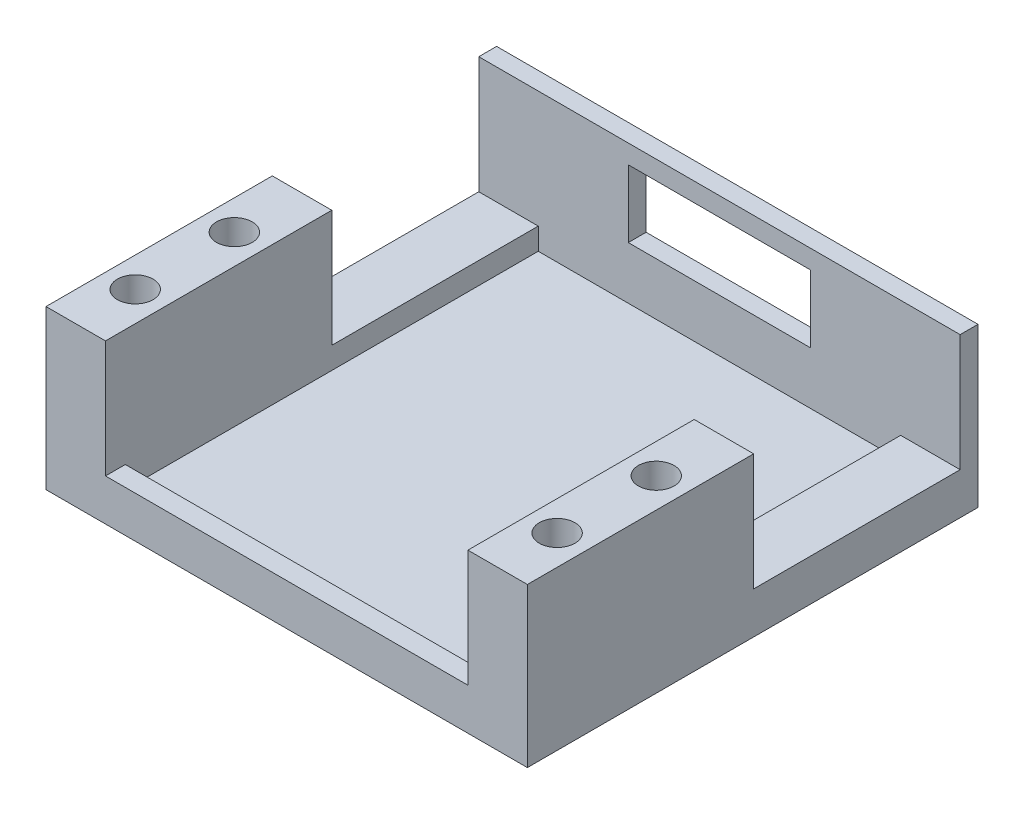
ISO-10303-21;
HEADER;
FILE_DESCRIPTION(('STEP AP214'),'2;1');
FILE_NAME('part.step','',(''),(''),'','','');
FILE_SCHEMA(('AUTOMOTIVE_DESIGN { 1 0 10303 214 1 1 1 1 }'));
ENDSEC;
DATA;
#1=APPLICATION_CONTEXT('core data for automotive mechanical design processes');
#2=APPLICATION_PROTOCOL_DEFINITION('international standard','automotive_design',2000,#1);
#3=PRODUCT_CONTEXT('',#1,'mechanical');
#4=PRODUCT('Part','Part','',(#3));
#5=PRODUCT_RELATED_PRODUCT_CATEGORY('part','',(#4));
#6=PRODUCT_DEFINITION_FORMATION('','',#4);
#7=PRODUCT_DEFINITION_CONTEXT('part definition',#1,'design');
#8=PRODUCT_DEFINITION('design','',#6,#7);
#9=PRODUCT_DEFINITION_SHAPE('','',#8);
#10=(LENGTH_UNIT() NAMED_UNIT(*) SI_UNIT(.MILLI.,.METRE.));
#11=(NAMED_UNIT(*) PLANE_ANGLE_UNIT() SI_UNIT($,.RADIAN.));
#12=(NAMED_UNIT(*) SI_UNIT($,.STERADIAN.) SOLID_ANGLE_UNIT());
#13=UNCERTAINTY_MEASURE_WITH_UNIT(LENGTH_MEASURE(1.E-05),#10,'distance_accuracy_value','');
#14=(GEOMETRIC_REPRESENTATION_CONTEXT(3) GLOBAL_UNCERTAINTY_ASSIGNED_CONTEXT((#13)) GLOBAL_UNIT_ASSIGNED_CONTEXT((#10,
#11,#12)) REPRESENTATION_CONTEXT('',''));
#15=CARTESIAN_POINT('',(0.,0.,0.));
#16=DIRECTION('',(0.,0.,1.));
#17=DIRECTION('',(1.,0.,0.));
#18=AXIS2_PLACEMENT_3D('',#15,#16,#17);
#19=CARTESIAN_POINT('',(0.,0.,0.));
#20=DIRECTION('',(0.,1.,0.));
#21=DIRECTION('',(0.,0.,1.));
#22=AXIS2_PLACEMENT_3D('',#19,#20,#21);
#23=PLANE('',#22);
#24=DIRECTION('',(1.,0.,0.));
#25=VECTOR('',#24,1.);
#26=CARTESIAN_POINT('',(0.,0.,1.));
#27=LINE('',#26,#25);
#28=CARTESIAN_POINT('',(0.,0.,1.));
#29=VERTEX_POINT('',#28);
#30=CARTESIAN_POINT('',(18.28,0.,1.));
#31=VERTEX_POINT('',#30);
#32=EDGE_CURVE('E292',#29,#31,#27,.T.);
#33=ORIENTED_EDGE('',*,*,#32,.T.);
#34=DIRECTION('',(0.,0.,1.));
#35=VECTOR('',#34,1.);
#36=CARTESIAN_POINT('',(18.28,0.,-10.414));
#37=LINE('',#36,#35);
#38=CARTESIAN_POINT('',(18.28,0.,0.));
#39=VERTEX_POINT('',#38);
#40=EDGE_CURVE('E192',#39,#31,#37,.T.);
#41=ORIENTED_EDGE('',*,*,#40,.F.);
#42=DIRECTION('',(1.,0.,0.));
#43=VECTOR('',#42,1.);
#44=CARTESIAN_POINT('',(0.,0.,0.));
#45=LINE('',#44,#43);
#46=CARTESIAN_POINT('',(0.,0.,0.));
#47=VERTEX_POINT('',#46);
#48=EDGE_CURVE('E282',#47,#39,#45,.T.);
#49=ORIENTED_EDGE('',*,*,#48,.F.);
#50=DIRECTION('',(0.,0.,-1.));
#51=VECTOR('',#50,1.);
#52=CARTESIAN_POINT('',(0.,0.,-10.414));
#53=LINE('',#52,#51);
#54=EDGE_CURVE('E217',#29,#47,#53,.T.);
#55=ORIENTED_EDGE('',*,*,#54,.F.);
#56=EDGE_LOOP('',(#33,#41,#49,#55));
#57=FACE_BOUND('',#56,.T.);
#58=ADVANCED_FACE('F39',(#57),#23,.T.);
#59=DIRECTION('',(0.,0.,-1.));
#60=VECTOR('',#59,1.);
#61=CARTESIAN_POINT('',(18.28,0.,0.));
#62=LINE('',#61,#60);
#63=CARTESIAN_POINT('',(18.28,0.,-10.414));
#64=VERTEX_POINT('',#63);
#65=CARTESIAN_POINT('',(18.28,0.,-20.828));
#66=VERTEX_POINT('',#65);
#67=EDGE_CURVE('E59',#64,#66,#62,.T.);
#68=ORIENTED_EDGE('',*,*,#67,.F.);
#69=DIRECTION('',(-1.,0.,0.));
#70=VECTOR('',#69,1.);
#71=CARTESIAN_POINT('',(21.28,0.,-10.414));
#72=LINE('',#71,#70);
#73=CARTESIAN_POINT('',(21.28,0.,-10.414));
#74=VERTEX_POINT('',#73);
#75=EDGE_CURVE('E54',#74,#64,#72,.T.);
#76=ORIENTED_EDGE('',*,*,#75,.F.);
#77=DIRECTION('',(0.,0.,1.));
#78=VECTOR('',#77,1.);
#79=CARTESIAN_POINT('',(21.28,0.,0.));
#80=LINE('',#79,#78);
#81=CARTESIAN_POINT('',(21.28,0.,-20.828));
#82=VERTEX_POINT('',#81);
#83=EDGE_CURVE('E297',#82,#74,#80,.T.);
#84=ORIENTED_EDGE('',*,*,#83,.F.);
#85=DIRECTION('',(1.,0.,0.));
#86=VECTOR('',#85,1.);
#87=CARTESIAN_POINT('',(0.,0.,-20.828));
#88=LINE('',#87,#86);
#89=EDGE_CURVE('E315',#66,#82,#88,.T.);
#90=ORIENTED_EDGE('',*,*,#89,.F.);
#91=EDGE_LOOP('',(#68,#76,#84,#90));
#92=FACE_BOUND('',#91,.T.);
#93=ADVANCED_FACE('F356',(#92),#23,.T.);
#94=DIRECTION('',(0.,0.,1.));
#95=VECTOR('',#94,1.);
#96=CARTESIAN_POINT('',(-3.,0.,0.));
#97=LINE('',#96,#95);
#98=CARTESIAN_POINT('',(-3.,0.,-20.828));
#99=VERTEX_POINT('',#98);
#100=CARTESIAN_POINT('',(-3.,0.,-10.414));
#101=VERTEX_POINT('',#100);
#102=EDGE_CURVE('E294',#99,#101,#97,.T.);
#103=ORIENTED_EDGE('',*,*,#102,.T.);
#104=DIRECTION('',(-1.,0.,0.));
#105=VECTOR('',#104,1.);
#106=CARTESIAN_POINT('',(-3.,0.,-10.414));
#107=LINE('',#106,#105);
#108=CARTESIAN_POINT('',(0.,0.,-10.414));
#109=VERTEX_POINT('',#108);
#110=EDGE_CURVE('E220',#109,#101,#107,.T.);
#111=ORIENTED_EDGE('',*,*,#110,.F.);
#112=DIRECTION('',(0.,0.,-1.));
#113=VECTOR('',#112,1.);
#114=CARTESIAN_POINT('',(0.,0.,0.));
#115=LINE('',#114,#113);
#116=CARTESIAN_POINT('',(0.,0.,-20.828));
#117=VERTEX_POINT('',#116);
#118=EDGE_CURVE('E289',#109,#117,#115,.T.);
#119=ORIENTED_EDGE('',*,*,#118,.T.);
#120=EDGE_CURVE('E322',#99,#117,#88,.T.);
#121=ORIENTED_EDGE('',*,*,#120,.F.);
#122=EDGE_LOOP('',(#103,#111,#119,#121));
#123=FACE_BOUND('',#122,.T.);
#124=ADVANCED_FACE('F358',(#123),#23,.T.);
#125=CARTESIAN_POINT('',(0.,1.55,0.));
#126=DIRECTION('',(0.,1.,0.));
#127=DIRECTION('',(0.,0.,1.));
#128=AXIS2_PLACEMENT_3D('',#125,#126,#127);
#129=PLANE('',#128);
#130=DIRECTION('',(1.,0.,0.));
#131=VECTOR('',#130,1.);
#132=CARTESIAN_POINT('',(0.,1.55,-20.828));
#133=LINE('',#132,#131);
#134=CARTESIAN_POINT('',(4.54,1.55,-20.828));
#135=VERTEX_POINT('',#134);
#136=CARTESIAN_POINT('',(13.74,1.55,-20.828));
#137=VERTEX_POINT('',#136);
#138=EDGE_CURVE('E318',#135,#137,#133,.T.);
#139=ORIENTED_EDGE('',*,*,#138,.T.);
#140=DIRECTION('',(0.,0.,1.));
#141=VECTOR('',#140,1.);
#142=CARTESIAN_POINT('',(13.74,1.55,0.));
#143=LINE('',#142,#141);
#144=CARTESIAN_POINT('',(13.74,1.55,-21.728));
#145=VERTEX_POINT('',#144);
#146=EDGE_CURVE('E247',#145,#137,#143,.T.);
#147=ORIENTED_EDGE('',*,*,#146,.F.);
#148=DIRECTION('',(1.,0.,0.));
#149=VECTOR('',#148,1.);
#150=CARTESIAN_POINT('',(0.,1.55,-21.728));
#151=LINE('',#150,#149);
#152=CARTESIAN_POINT('',(4.54,1.55,-21.728));
#153=VERTEX_POINT('',#152);
#154=EDGE_CURVE('E321',#153,#145,#151,.T.);
#155=ORIENTED_EDGE('',*,*,#154,.F.);
#156=DIRECTION('',(0.,0.,1.));
#157=VECTOR('',#156,1.);
#158=CARTESIAN_POINT('',(4.54,1.55,0.));
#159=LINE('',#158,#157);
#160=EDGE_CURVE('E261',#153,#135,#159,.T.);
#161=ORIENTED_EDGE('',*,*,#160,.T.);
#162=EDGE_LOOP('',(#139,#147,#155,#161));
#163=FACE_BOUND('',#162,.T.);
#164=ADVANCED_FACE('F364',(#163),#129,.T.);
#165=CARTESIAN_POINT('',(0.,1.55,-20.828));
#166=DIRECTION('',(0.,0.,-1.));
#167=DIRECTION('',(-1.,0.,0.));
#168=AXIS2_PLACEMENT_3D('',#165,#166,#167);
#169=PLANE('',#168);
#170=DIRECTION('',(0.,-1.,0.));
#171=VECTOR('',#170,1.);
#172=CARTESIAN_POINT('',(4.54,4.95,-20.828));
#173=LINE('',#172,#171);
#174=CARTESIAN_POINT('',(4.54,4.95,-20.828));
#175=VERTEX_POINT('',#174);
#176=EDGE_CURVE('E265',#175,#135,#173,.T.);
#177=ORIENTED_EDGE('',*,*,#176,.F.);
#178=DIRECTION('',(1.,0.,0.));
#179=VECTOR('',#178,1.);
#180=CARTESIAN_POINT('',(-3.,4.95,-20.828));
#181=LINE('',#180,#179);
#182=CARTESIAN_POINT('',(13.74,4.95,-20.828));
#183=VERTEX_POINT('',#182);
#184=EDGE_CURVE('E216',#175,#183,#181,.T.);
#185=ORIENTED_EDGE('',*,*,#184,.T.);
#186=DIRECTION('',(0.,-1.,0.));
#187=VECTOR('',#186,1.);
#188=CARTESIAN_POINT('',(13.74,4.95,-20.828));
#189=LINE('',#188,#187);
#190=EDGE_CURVE('E255',#183,#137,#189,.T.);
#191=ORIENTED_EDGE('',*,*,#190,.T.);
#192=ORIENTED_EDGE('',*,*,#138,.F.);
#193=EDGE_LOOP('',(#177,#185,#191,#192));
#194=FACE_BOUND('',#193,.T.);
#195=DIRECTION('',(0.,1.,0.));
#196=VECTOR('',#195,1.);
#197=CARTESIAN_POINT('',(0.,-35.3577868175259,-20.828));
#198=LINE('',#197,#196);
#199=CARTESIAN_POINT('',(0.,-1.1,-20.828));
#200=VERTEX_POINT('',#199);
#201=EDGE_CURVE('E281',#200,#117,#198,.T.);
#202=ORIENTED_EDGE('',*,*,#201,.F.);
#203=DIRECTION('',(1.,0.,0.));
#204=VECTOR('',#203,1.);
#205=CARTESIAN_POINT('',(0.,-1.1,-20.828));
#206=LINE('',#205,#204);
#207=CARTESIAN_POINT('',(18.28,-1.1,-20.828));
#208=VERTEX_POINT('',#207);
#209=EDGE_CURVE('E275',#200,#208,#206,.T.);
#210=ORIENTED_EDGE('',*,*,#209,.T.);
#211=DIRECTION('',(0.,1.,0.));
#212=VECTOR('',#211,1.);
#213=CARTESIAN_POINT('',(18.28,-35.3577868175259,-20.828));
#214=LINE('',#213,#212);
#215=EDGE_CURVE('E296',#208,#66,#214,.T.);
#216=ORIENTED_EDGE('',*,*,#215,.T.);
#217=ORIENTED_EDGE('',*,*,#89,.T.);
#218=DIRECTION('',(0.,-1.,0.));
#219=VECTOR('',#218,1.);
#220=CARTESIAN_POINT('',(21.28,1.55,-20.828));
#221=LINE('',#220,#219);
#222=CARTESIAN_POINT('',(21.28,5.9,-20.828));
#223=VERTEX_POINT('',#222);
#224=EDGE_CURVE('E11',#223,#82,#221,.T.);
#225=ORIENTED_EDGE('',*,*,#224,.F.);
#226=DIRECTION('',(1.,0.,0.));
#227=VECTOR('',#226,1.);
#228=CARTESIAN_POINT('',(-3.,5.9,-20.828));
#229=LINE('',#228,#227);
#230=CARTESIAN_POINT('',(-3.,5.9,-20.828));
#231=VERTEX_POINT('',#230);
#232=EDGE_CURVE('E237',#231,#223,#229,.T.);
#233=ORIENTED_EDGE('',*,*,#232,.F.);
#234=DIRECTION('',(0.,-1.,0.));
#235=VECTOR('',#234,1.);
#236=CARTESIAN_POINT('',(-3.,1.55,-20.828));
#237=LINE('',#236,#235);
#238=EDGE_CURVE('E325',#231,#99,#237,.T.);
#239=ORIENTED_EDGE('',*,*,#238,.T.);
#240=ORIENTED_EDGE('',*,*,#120,.T.);
#241=EDGE_LOOP('',(#202,#210,#216,#217,#225,#233,#239,#240));
#242=FACE_BOUND('',#241,.T.);
#243=ADVANCED_FACE('F41',(#194,#242),#169,.F.);
#244=CARTESIAN_POINT('',(21.28,1.55,0.));
#245=DIRECTION('',(-1.,0.,0.));
#246=DIRECTION('',(0.,0.,1.));
#247=AXIS2_PLACEMENT_3D('',#244,#245,#246);
#248=PLANE('',#247);
#249=ORIENTED_EDGE('',*,*,#224,.T.);
#250=ORIENTED_EDGE('',*,*,#83,.T.);
#251=DIRECTION('',(0.,-1.,0.));
#252=VECTOR('',#251,1.);
#253=CARTESIAN_POINT('',(21.28,17.7016692039728,-10.414));
#254=LINE('',#253,#252);
#255=CARTESIAN_POINT('',(21.28,5.9,-10.414));
#256=VERTEX_POINT('',#255);
#257=EDGE_CURVE('E194',#256,#74,#254,.T.);
#258=ORIENTED_EDGE('',*,*,#257,.F.);
#259=DIRECTION('',(0.,0.,1.));
#260=VECTOR('',#259,1.);
#261=CARTESIAN_POINT('',(21.28,5.9,-10.414));
#262=LINE('',#261,#260);
#263=CARTESIAN_POINT('',(21.28,5.9,1.));
#264=VERTEX_POINT('',#263);
#265=EDGE_CURVE('E201',#256,#264,#262,.T.);
#266=ORIENTED_EDGE('',*,*,#265,.T.);
#267=DIRECTION('',(0.,1.,0.));
#268=VECTOR('',#267,1.);
#269=CARTESIAN_POINT('',(21.28,-35.3577868175259,1.));
#270=LINE('',#269,#268);
#271=CARTESIAN_POINT('',(21.28,-2.1,1.));
#272=VERTEX_POINT('',#271);
#273=EDGE_CURVE('E200',#272,#264,#270,.T.);
#274=ORIENTED_EDGE('',*,*,#273,.F.);
#275=DIRECTION('',(0.,0.,-1.));
#276=VECTOR('',#275,1.);
#277=CARTESIAN_POINT('',(21.28,-2.1,0.));
#278=LINE('',#277,#276);
#279=CARTESIAN_POINT('',(21.28,-2.1,-21.728));
#280=VERTEX_POINT('',#279);
#281=EDGE_CURVE('E288',#272,#280,#278,.T.);
#282=ORIENTED_EDGE('',*,*,#281,.T.);
#283=DIRECTION('',(0.,-1.,0.));
#284=VECTOR('',#283,1.);
#285=CARTESIAN_POINT('',(21.28,1.55,-21.728));
#286=LINE('',#285,#284);
#287=CARTESIAN_POINT('',(21.28,5.9,-21.728));
#288=VERTEX_POINT('',#287);
#289=EDGE_CURVE('E47',#288,#280,#286,.T.);
#290=ORIENTED_EDGE('',*,*,#289,.F.);
#291=DIRECTION('',(0.,0.,-1.));
#292=VECTOR('',#291,1.);
#293=CARTESIAN_POINT('',(21.28,5.9,-20.828));
#294=LINE('',#293,#292);
#295=EDGE_CURVE('E241',#223,#288,#294,.T.);
#296=ORIENTED_EDGE('',*,*,#295,.F.);
#297=EDGE_LOOP('',(#249,#250,#258,#266,#274,#282,#290,#296));
#298=FACE_BOUND('',#297,.T.);
#299=ADVANCED_FACE('F341',(#298),#248,.F.);
#300=CARTESIAN_POINT('',(0.,1.55,-21.728));
#301=DIRECTION('',(0.,0.,-1.));
#302=DIRECTION('',(-1.,0.,0.));
#303=AXIS2_PLACEMENT_3D('',#300,#301,#302);
#304=PLANE('',#303);
#305=DIRECTION('',(0.,-1.,0.));
#306=VECTOR('',#305,1.);
#307=CARTESIAN_POINT('',(-3.,1.55,-21.728));
#308=LINE('',#307,#306);
#309=CARTESIAN_POINT('',(-3.,5.9,-21.728));
#310=VERTEX_POINT('',#309);
#311=CARTESIAN_POINT('',(-3.,-2.1,-21.728));
#312=VERTEX_POINT('',#311);
#313=EDGE_CURVE('E330',#310,#312,#308,.T.);
#314=ORIENTED_EDGE('',*,*,#313,.F.);
#315=DIRECTION('',(-1.,0.,0.));
#316=VECTOR('',#315,1.);
#317=CARTESIAN_POINT('',(-3.,5.9,-21.728));
#318=LINE('',#317,#316);
#319=EDGE_CURVE('E244',#288,#310,#318,.T.);
#320=ORIENTED_EDGE('',*,*,#319,.F.);
#321=ORIENTED_EDGE('',*,*,#289,.T.);
#322=DIRECTION('',(-1.,0.,0.));
#323=VECTOR('',#322,1.);
#324=CARTESIAN_POINT('',(0.,-2.1,-21.728));
#325=LINE('',#324,#323);
#326=EDGE_CURVE('E303',#280,#312,#325,.T.);
#327=ORIENTED_EDGE('',*,*,#326,.T.);
#328=EDGE_LOOP('',(#314,#320,#321,#327));
#329=FACE_BOUND('',#328,.T.);
#330=DIRECTION('',(-1.,0.,0.));
#331=VECTOR('',#330,1.);
#332=CARTESIAN_POINT('',(-3.,4.95,-21.728));
#333=LINE('',#332,#331);
#334=CARTESIAN_POINT('',(13.74,4.95,-21.728));
#335=VERTEX_POINT('',#334);
#336=CARTESIAN_POINT('',(4.54,4.95,-21.728));
#337=VERTEX_POINT('',#336);
#338=EDGE_CURVE('E238',#335,#337,#333,.T.);
#339=ORIENTED_EDGE('',*,*,#338,.T.);
#340=DIRECTION('',(0.,-1.,0.));
#341=VECTOR('',#340,1.);
#342=CARTESIAN_POINT('',(4.54,4.95,-21.728));
#343=LINE('',#342,#341);
#344=EDGE_CURVE('E269',#337,#153,#343,.T.);
#345=ORIENTED_EDGE('',*,*,#344,.T.);
#346=ORIENTED_EDGE('',*,*,#154,.T.);
#347=DIRECTION('',(0.,-1.,0.));
#348=VECTOR('',#347,1.);
#349=CARTESIAN_POINT('',(13.74,4.95,-21.728));
#350=LINE('',#349,#348);
#351=EDGE_CURVE('E259',#335,#145,#350,.T.);
#352=ORIENTED_EDGE('',*,*,#351,.F.);
#353=EDGE_LOOP('',(#339,#345,#346,#352));
#354=FACE_BOUND('',#353,.T.);
#355=ADVANCED_FACE('F334',(#329,#354),#304,.T.);
#356=CARTESIAN_POINT('',(-3.,1.55,0.));
#357=DIRECTION('',(-1.,0.,0.));
#358=DIRECTION('',(0.,0.,1.));
#359=AXIS2_PLACEMENT_3D('',#356,#357,#358);
#360=PLANE('',#359);
#361=ORIENTED_EDGE('',*,*,#313,.T.);
#362=DIRECTION('',(0.,0.,-1.));
#363=VECTOR('',#362,1.);
#364=CARTESIAN_POINT('',(-3.,-2.1,0.));
#365=LINE('',#364,#363);
#366=CARTESIAN_POINT('',(-3.,-2.1,1.));
#367=VERTEX_POINT('',#366);
#368=EDGE_CURVE('E312',#367,#312,#365,.T.);
#369=ORIENTED_EDGE('',*,*,#368,.F.);
#370=DIRECTION('',(0.,1.,0.));
#371=VECTOR('',#370,1.);
#372=CARTESIAN_POINT('',(-3.,-35.3577868175259,1.));
#373=LINE('',#372,#371);
#374=CARTESIAN_POINT('',(-3.,5.9,1.));
#375=VERTEX_POINT('',#374);
#376=EDGE_CURVE('E307',#367,#375,#373,.T.);
#377=ORIENTED_EDGE('',*,*,#376,.T.);
#378=DIRECTION('',(0.,0.,-1.));
#379=VECTOR('',#378,1.);
#380=CARTESIAN_POINT('',(-3.,5.9,-10.414));
#381=LINE('',#380,#379);
#382=CARTESIAN_POINT('',(-3.,5.9,-10.414));
#383=VERTEX_POINT('',#382);
#384=EDGE_CURVE('E213',#375,#383,#381,.T.);
#385=ORIENTED_EDGE('',*,*,#384,.T.);
#386=DIRECTION('',(0.,-1.,0.));
#387=VECTOR('',#386,1.);
#388=CARTESIAN_POINT('',(-3.,17.7016692039728,-10.414));
#389=LINE('',#388,#387);
#390=EDGE_CURVE('E223',#383,#101,#389,.T.);
#391=ORIENTED_EDGE('',*,*,#390,.T.);
#392=ORIENTED_EDGE('',*,*,#102,.F.);
#393=ORIENTED_EDGE('',*,*,#238,.F.);
#394=DIRECTION('',(0.,0.,1.));
#395=VECTOR('',#394,1.);
#396=CARTESIAN_POINT('',(-3.,5.9,-20.828));
#397=LINE('',#396,#395);
#398=EDGE_CURVE('E234',#310,#231,#397,.T.);
#399=ORIENTED_EDGE('',*,*,#398,.F.);
#400=EDGE_LOOP('',(#361,#369,#377,#385,#391,#392,#393,#399));
#401=FACE_BOUND('',#400,.T.);
#402=ADVANCED_FACE('F347',(#401),#360,.T.);
#403=CARTESIAN_POINT('',(0.,-35.3577868175259,0.));
#404=DIRECTION('',(1.,0.,0.));
#405=DIRECTION('',(0.,0.,-1.));
#406=AXIS2_PLACEMENT_3D('',#403,#404,#405);
#407=PLANE('',#406);
#408=DIRECTION('',(0.,0.,-1.));
#409=VECTOR('',#408,1.);
#410=CARTESIAN_POINT('',(0.,-1.1,0.));
#411=LINE('',#410,#409);
#412=CARTESIAN_POINT('',(0.,-1.1,0.));
#413=VERTEX_POINT('',#412);
#414=EDGE_CURVE('E278',#413,#200,#411,.T.);
#415=ORIENTED_EDGE('',*,*,#414,.T.);
#416=ORIENTED_EDGE('',*,*,#201,.T.);
#417=ORIENTED_EDGE('',*,*,#118,.F.);
#418=DIRECTION('',(0.,-1.,0.));
#419=VECTOR('',#418,1.);
#420=CARTESIAN_POINT('',(0.,17.7016692039728,-10.414));
#421=LINE('',#420,#419);
#422=CARTESIAN_POINT('',(0.,5.9,-10.414));
#423=VERTEX_POINT('',#422);
#424=EDGE_CURVE('E226',#423,#109,#421,.T.);
#425=ORIENTED_EDGE('',*,*,#424,.F.);
#426=DIRECTION('',(0.,0.,1.));
#427=VECTOR('',#426,1.);
#428=CARTESIAN_POINT('',(0.,5.9,-10.414));
#429=LINE('',#428,#427);
#430=CARTESIAN_POINT('',(0.,5.9,1.));
#431=VERTEX_POINT('',#430);
#432=EDGE_CURVE('E206',#423,#431,#429,.T.);
#433=ORIENTED_EDGE('',*,*,#432,.T.);
#434=DIRECTION('',(0.,-1.,0.));
#435=VECTOR('',#434,1.);
#436=CARTESIAN_POINT('',(0.,17.7016692039728,1.));
#437=LINE('',#436,#435);
#438=EDGE_CURVE('E229',#431,#29,#437,.T.);
#439=ORIENTED_EDGE('',*,*,#438,.T.);
#440=ORIENTED_EDGE('',*,*,#54,.T.);
#441=DIRECTION('',(0.,1.,0.));
#442=VECTOR('',#441,1.);
#443=CARTESIAN_POINT('',(0.,-35.3577868175259,0.));
#444=LINE('',#443,#442);
#445=EDGE_CURVE('E286',#413,#47,#444,.T.);
#446=ORIENTED_EDGE('',*,*,#445,.F.);
#447=EDGE_LOOP('',(#415,#416,#417,#425,#433,#439,#440,#446));
#448=FACE_BOUND('',#447,.T.);
#449=ADVANCED_FACE('F378',(#448),#407,.T.);
#450=CARTESIAN_POINT('',(0.,-35.3577868175259,0.));
#451=DIRECTION('',(0.,0.,1.));
#452=DIRECTION('',(1.,0.,0.));
#453=AXIS2_PLACEMENT_3D('',#450,#451,#452);
#454=PLANE('',#453);
#455=DIRECTION('',(0.,1.,0.));
#456=VECTOR('',#455,1.);
#457=CARTESIAN_POINT('',(18.28,-35.3577868175259,0.));
#458=LINE('',#457,#456);
#459=CARTESIAN_POINT('',(18.28,-1.1,0.));
#460=VERTEX_POINT('',#459);
#461=EDGE_CURVE('E285',#460,#39,#458,.T.);
#462=ORIENTED_EDGE('',*,*,#461,.F.);
#463=DIRECTION('',(1.,0.,0.));
#464=VECTOR('',#463,1.);
#465=CARTESIAN_POINT('',(0.,-1.1,0.));
#466=LINE('',#465,#464);
#467=EDGE_CURVE('E271',#413,#460,#466,.T.);
#468=ORIENTED_EDGE('',*,*,#467,.F.);
#469=ORIENTED_EDGE('',*,*,#445,.T.);
#470=ORIENTED_EDGE('',*,*,#48,.T.);
#471=EDGE_LOOP('',(#462,#468,#469,#470));
#472=FACE_BOUND('',#471,.T.);
#473=ADVANCED_FACE('F375',(#472),#454,.F.);
#474=CARTESIAN_POINT('',(18.28,-35.3577868175259,0.));
#475=DIRECTION('',(1.,0.,0.));
#476=DIRECTION('',(0.,0.,-1.));
#477=AXIS2_PLACEMENT_3D('',#474,#475,#476);
#478=PLANE('',#477);
#479=ORIENTED_EDGE('',*,*,#215,.F.);
#480=DIRECTION('',(0.,0.,-1.));
#481=VECTOR('',#480,1.);
#482=CARTESIAN_POINT('',(18.28,-1.1,0.));
#483=LINE('',#482,#481);
#484=EDGE_CURVE('E273',#460,#208,#483,.T.);
#485=ORIENTED_EDGE('',*,*,#484,.F.);
#486=ORIENTED_EDGE('',*,*,#461,.T.);
#487=ORIENTED_EDGE('',*,*,#40,.T.);
#488=DIRECTION('',(0.,-1.,0.));
#489=VECTOR('',#488,1.);
#490=CARTESIAN_POINT('',(18.28,17.7016692039728,1.));
#491=LINE('',#490,#489);
#492=CARTESIAN_POINT('',(18.28,5.9,1.));
#493=VERTEX_POINT('',#492);
#494=EDGE_CURVE('E188',#493,#31,#491,.T.);
#495=ORIENTED_EDGE('',*,*,#494,.F.);
#496=DIRECTION('',(0.,0.,-1.));
#497=VECTOR('',#496,1.);
#498=CARTESIAN_POINT('',(18.28,5.9,-10.414));
#499=LINE('',#498,#497);
#500=CARTESIAN_POINT('',(18.28,5.9,-10.414));
#501=VERTEX_POINT('',#500);
#502=EDGE_CURVE('E175',#493,#501,#499,.T.);
#503=ORIENTED_EDGE('',*,*,#502,.T.);
#504=DIRECTION('',(0.,-1.,0.));
#505=VECTOR('',#504,1.);
#506=CARTESIAN_POINT('',(18.28,17.7016692039728,-10.414));
#507=LINE('',#506,#505);
#508=EDGE_CURVE('E195',#501,#64,#507,.T.);
#509=ORIENTED_EDGE('',*,*,#508,.T.);
#510=ORIENTED_EDGE('',*,*,#67,.T.);
#511=EDGE_LOOP('',(#479,#485,#486,#487,#495,#503,#509,#510));
#512=FACE_BOUND('',#511,.T.);
#513=ADVANCED_FACE('F190',(#512),#478,.F.);
#514=CARTESIAN_POINT('',(0.,-35.3577868175259,1.));
#515=DIRECTION('',(0.,0.,1.));
#516=DIRECTION('',(1.,0.,0.));
#517=AXIS2_PLACEMENT_3D('',#514,#515,#516);
#518=PLANE('',#517);
#519=DIRECTION('',(-1.,0.,0.));
#520=VECTOR('',#519,1.);
#521=CARTESIAN_POINT('',(0.,-2.1,1.));
#522=LINE('',#521,#520);
#523=EDGE_CURVE('E291',#272,#367,#522,.T.);
#524=ORIENTED_EDGE('',*,*,#523,.F.);
#525=ORIENTED_EDGE('',*,*,#273,.T.);
#526=DIRECTION('',(-1.,0.,0.));
#527=VECTOR('',#526,1.);
#528=CARTESIAN_POINT('',(21.28,5.9,1.));
#529=LINE('',#528,#527);
#530=EDGE_CURVE('E179',#264,#493,#529,.T.);
#531=ORIENTED_EDGE('',*,*,#530,.T.);
#532=ORIENTED_EDGE('',*,*,#494,.T.);
#533=ORIENTED_EDGE('',*,*,#32,.F.);
#534=ORIENTED_EDGE('',*,*,#438,.F.);
#535=DIRECTION('',(-1.,0.,0.));
#536=VECTOR('',#535,1.);
#537=CARTESIAN_POINT('',(-3.,5.9,1.));
#538=LINE('',#537,#536);
#539=EDGE_CURVE('E209',#431,#375,#538,.T.);
#540=ORIENTED_EDGE('',*,*,#539,.T.);
#541=ORIENTED_EDGE('',*,*,#376,.F.);
#542=EDGE_LOOP('',(#524,#525,#531,#532,#533,#534,#540,#541));
#543=FACE_BOUND('',#542,.T.);
#544=ADVANCED_FACE('F198',(#543),#518,.T.);
#545=CARTESIAN_POINT('',(0.,-2.1,0.));
#546=DIRECTION('',(0.,1.,0.));
#547=DIRECTION('',(0.,0.,1.));
#548=AXIS2_PLACEMENT_3D('',#545,#546,#547);
#549=PLANE('',#548);
#550=CARTESIAN_POINT('',(19.78,-2.1,-2.));
#551=DIRECTION('',(0.,1.,0.));
#552=DIRECTION('',(0.,0.,1.));
#553=AXIS2_PLACEMENT_3D('',#550,#551,#552);
#554=CIRCLE('',#553,0.9);
#555=CARTESIAN_POINT('',(19.78,-2.1,-1.1));
#556=VERTEX_POINT('',#555);
#557=EDGE_CURVE('E474',#556,#556,#554,.T.);
#558=ORIENTED_EDGE('',*,*,#557,.T.);
#559=EDGE_LOOP('',(#558));
#560=FACE_BOUND('',#559,.T.);
#561=CARTESIAN_POINT('',(-1.5,-2.1,-7.));
#562=DIRECTION('',(0.,1.,0.));
#563=DIRECTION('',(0.,0.,1.));
#564=AXIS2_PLACEMENT_3D('',#561,#562,#563);
#565=CIRCLE('',#564,0.899999999999999);
#566=CARTESIAN_POINT('',(-1.5,-2.1,-6.1));
#567=VERTEX_POINT('',#566);
#568=EDGE_CURVE('E463',#567,#567,#565,.T.);
#569=ORIENTED_EDGE('',*,*,#568,.T.);
#570=EDGE_LOOP('',(#569));
#571=FACE_BOUND('',#570,.T.);
#572=CARTESIAN_POINT('',(19.78,-2.1,-7.));
#573=DIRECTION('',(0.,1.,0.));
#574=DIRECTION('',(0.,0.,1.));
#575=AXIS2_PLACEMENT_3D('',#572,#573,#574);
#576=CIRCLE('',#575,0.9);
#577=CARTESIAN_POINT('',(19.78,-2.1,-6.1));
#578=VERTEX_POINT('',#577);
#579=EDGE_CURVE('E458',#578,#578,#576,.T.);
#580=ORIENTED_EDGE('',*,*,#579,.T.);
#581=EDGE_LOOP('',(#580));
#582=FACE_BOUND('',#581,.T.);
#583=CARTESIAN_POINT('',(-1.5,-2.1,-2.));
#584=DIRECTION('',(0.,1.,0.));
#585=DIRECTION('',(0.,0.,1.));
#586=AXIS2_PLACEMENT_3D('',#583,#584,#585);
#587=CIRCLE('',#586,0.9);
#588=CARTESIAN_POINT('',(-1.5,-2.1,-1.1));
#589=VERTEX_POINT('',#588);
#590=EDGE_CURVE('E479',#589,#589,#587,.T.);
#591=ORIENTED_EDGE('',*,*,#590,.T.);
#592=EDGE_LOOP('',(#591));
#593=FACE_BOUND('',#592,.T.);
#594=ORIENTED_EDGE('',*,*,#523,.T.);
#595=ORIENTED_EDGE('',*,*,#368,.T.);
#596=ORIENTED_EDGE('',*,*,#326,.F.);
#597=ORIENTED_EDGE('',*,*,#281,.F.);
#598=EDGE_LOOP('',(#594,#595,#596,#597));
#599=FACE_BOUND('',#598,.T.);
#600=ADVANCED_FACE('F339',(#560,#571,#582,#593,#599),#549,.F.);
#601=CARTESIAN_POINT('',(0.,-1.1,0.));
#602=DIRECTION('',(0.,1.,0.));
#603=DIRECTION('',(0.,0.,1.));
#604=AXIS2_PLACEMENT_3D('',#601,#602,#603);
#605=PLANE('',#604);
#606=ORIENTED_EDGE('',*,*,#467,.T.);
#607=ORIENTED_EDGE('',*,*,#484,.T.);
#608=ORIENTED_EDGE('',*,*,#209,.F.);
#609=ORIENTED_EDGE('',*,*,#414,.F.);
#610=EDGE_LOOP('',(#606,#607,#608,#609));
#611=FACE_BOUND('',#610,.T.);
#612=ADVANCED_FACE('F369',(#611),#605,.T.);
#613=CARTESIAN_POINT('',(4.54,4.95,0.));
#614=DIRECTION('',(1.,0.,0.));
#615=DIRECTION('',(0.,0.,-1.));
#616=AXIS2_PLACEMENT_3D('',#613,#614,#615);
#617=PLANE('',#616);
#618=ORIENTED_EDGE('',*,*,#160,.F.);
#619=ORIENTED_EDGE('',*,*,#344,.F.);
#620=DIRECTION('',(0.,0.,1.));
#621=VECTOR('',#620,1.);
#622=CARTESIAN_POINT('',(4.54,4.95,0.));
#623=LINE('',#622,#621);
#624=EDGE_CURVE('E262',#337,#175,#623,.T.);
#625=ORIENTED_EDGE('',*,*,#624,.T.);
#626=ORIENTED_EDGE('',*,*,#176,.T.);
#627=EDGE_LOOP('',(#618,#619,#625,#626));
#628=FACE_BOUND('',#627,.T.);
#629=ADVANCED_FACE('F404',(#628),#617,.T.);
#630=CARTESIAN_POINT('',(13.74,4.95,0.));
#631=DIRECTION('',(1.,0.,0.));
#632=DIRECTION('',(0.,0.,-1.));
#633=AXIS2_PLACEMENT_3D('',#630,#631,#632);
#634=PLANE('',#633);
#635=ORIENTED_EDGE('',*,*,#146,.T.);
#636=ORIENTED_EDGE('',*,*,#190,.F.);
#637=DIRECTION('',(0.,0.,1.));
#638=VECTOR('',#637,1.);
#639=CARTESIAN_POINT('',(13.74,4.95,0.));
#640=LINE('',#639,#638);
#641=EDGE_CURVE('E252',#335,#183,#640,.T.);
#642=ORIENTED_EDGE('',*,*,#641,.F.);
#643=ORIENTED_EDGE('',*,*,#351,.T.);
#644=EDGE_LOOP('',(#635,#636,#642,#643));
#645=FACE_BOUND('',#644,.T.);
#646=ADVANCED_FACE('F410',(#645),#634,.F.);
#647=CARTESIAN_POINT('',(0.,4.95,0.));
#648=DIRECTION('',(0.,-1.,0.));
#649=DIRECTION('',(0.,0.,-1.));
#650=AXIS2_PLACEMENT_3D('',#647,#648,#649);
#651=PLANE('',#650);
#652=ORIENTED_EDGE('',*,*,#184,.F.);
#653=ORIENTED_EDGE('',*,*,#624,.F.);
#654=ORIENTED_EDGE('',*,*,#338,.F.);
#655=ORIENTED_EDGE('',*,*,#641,.T.);
#656=EDGE_LOOP('',(#652,#653,#654,#655));
#657=FACE_BOUND('',#656,.T.);
#658=ADVANCED_FACE('F407',(#657),#651,.T.);
#659=CARTESIAN_POINT('',(0.,5.9,0.));
#660=DIRECTION('',(0.,-1.,0.));
#661=DIRECTION('',(0.,0.,-1.));
#662=AXIS2_PLACEMENT_3D('',#659,#660,#661);
#663=PLANE('',#662);
#664=ORIENTED_EDGE('',*,*,#398,.T.);
#665=ORIENTED_EDGE('',*,*,#232,.T.);
#666=ORIENTED_EDGE('',*,*,#295,.T.);
#667=ORIENTED_EDGE('',*,*,#319,.T.);
#668=EDGE_LOOP('',(#664,#665,#666,#667));
#669=FACE_BOUND('',#668,.T.);
#670=ADVANCED_FACE('F350',(#669),#663,.F.);
#671=CARTESIAN_POINT('',(-3.,17.7016692039728,-10.414));
#672=DIRECTION('',(0.,0.,1.));
#673=DIRECTION('',(1.,0.,0.));
#674=AXIS2_PLACEMENT_3D('',#671,#672,#673);
#675=PLANE('',#674);
#676=ORIENTED_EDGE('',*,*,#390,.F.);
#677=DIRECTION('',(1.,0.,0.));
#678=VECTOR('',#677,1.);
#679=CARTESIAN_POINT('',(-3.,5.9,-10.414));
#680=LINE('',#679,#678);
#681=EDGE_CURVE('E210',#383,#423,#680,.T.);
#682=ORIENTED_EDGE('',*,*,#681,.T.);
#683=ORIENTED_EDGE('',*,*,#424,.T.);
#684=ORIENTED_EDGE('',*,*,#110,.T.);
#685=EDGE_LOOP('',(#676,#682,#683,#684));
#686=FACE_BOUND('',#685,.T.);
#687=ADVANCED_FACE('F423',(#686),#675,.F.);
#688=CARTESIAN_POINT('',(0.,5.9,0.));
#689=DIRECTION('',(0.,-1.,0.));
#690=DIRECTION('',(0.,0.,-1.));
#691=AXIS2_PLACEMENT_3D('',#688,#689,#690);
#692=PLANE('',#691);
#693=CARTESIAN_POINT('',(-1.5,5.9,-7.));
#694=DIRECTION('',(0.,1.,0.));
#695=DIRECTION('',(0.,0.,1.));
#696=AXIS2_PLACEMENT_3D('',#693,#694,#695);
#697=CIRCLE('',#696,0.899999999999999);
#698=CARTESIAN_POINT('',(-1.5,5.9,-6.1));
#699=VERTEX_POINT('',#698);
#700=EDGE_CURVE('E466',#699,#699,#697,.T.);
#701=ORIENTED_EDGE('',*,*,#700,.F.);
#702=EDGE_LOOP('',(#701));
#703=FACE_BOUND('',#702,.T.);
#704=CARTESIAN_POINT('',(-1.5,5.9,-2.));
#705=DIRECTION('',(0.,1.,0.));
#706=DIRECTION('',(0.,0.,1.));
#707=AXIS2_PLACEMENT_3D('',#704,#705,#706);
#708=CIRCLE('',#707,0.9);
#709=CARTESIAN_POINT('',(-1.5,5.9,-1.1));
#710=VERTEX_POINT('',#709);
#711=EDGE_CURVE('E473',#710,#710,#708,.T.);
#712=ORIENTED_EDGE('',*,*,#711,.F.);
#713=EDGE_LOOP('',(#712));
#714=FACE_BOUND('',#713,.T.);
#715=ORIENTED_EDGE('',*,*,#539,.F.);
#716=ORIENTED_EDGE('',*,*,#432,.F.);
#717=ORIENTED_EDGE('',*,*,#681,.F.);
#718=ORIENTED_EDGE('',*,*,#384,.F.);
#719=EDGE_LOOP('',(#715,#716,#717,#718));
#720=FACE_BOUND('',#719,.T.);
#721=ADVANCED_FACE('F426',(#703,#714,#720),#692,.F.);
#722=CARTESIAN_POINT('',(21.28,17.7016692039728,-10.414));
#723=DIRECTION('',(0.,0.,1.));
#724=DIRECTION('',(1.,0.,0.));
#725=AXIS2_PLACEMENT_3D('',#722,#723,#724);
#726=PLANE('',#725);
#727=ORIENTED_EDGE('',*,*,#508,.F.);
#728=DIRECTION('',(1.,0.,0.));
#729=VECTOR('',#728,1.);
#730=CARTESIAN_POINT('',(21.28,5.9,-10.414));
#731=LINE('',#730,#729);
#732=EDGE_CURVE('E182',#501,#256,#731,.T.);
#733=ORIENTED_EDGE('',*,*,#732,.T.);
#734=ORIENTED_EDGE('',*,*,#257,.T.);
#735=ORIENTED_EDGE('',*,*,#75,.T.);
#736=EDGE_LOOP('',(#727,#733,#734,#735));
#737=FACE_BOUND('',#736,.T.);
#738=ADVANCED_FACE('F430',(#737),#726,.F.);
#739=CARTESIAN_POINT('',(0.,5.9,0.));
#740=DIRECTION('',(0.,-1.,0.));
#741=DIRECTION('',(0.,0.,-1.));
#742=AXIS2_PLACEMENT_3D('',#739,#740,#741);
#743=PLANE('',#742);
#744=CARTESIAN_POINT('',(19.78,5.9,-2.));
#745=DIRECTION('',(0.,1.,0.));
#746=DIRECTION('',(0.,0.,1.));
#747=AXIS2_PLACEMENT_3D('',#744,#745,#746);
#748=CIRCLE('',#747,0.9);
#749=CARTESIAN_POINT('',(19.78,5.9,-1.1));
#750=VERTEX_POINT('',#749);
#751=EDGE_CURVE('E470',#750,#750,#748,.T.);
#752=ORIENTED_EDGE('',*,*,#751,.F.);
#753=EDGE_LOOP('',(#752));
#754=FACE_BOUND('',#753,.T.);
#755=CARTESIAN_POINT('',(19.78,5.9,-7.));
#756=DIRECTION('',(0.,1.,0.));
#757=DIRECTION('',(0.,0.,1.));
#758=AXIS2_PLACEMENT_3D('',#755,#756,#757);
#759=CIRCLE('',#758,0.9);
#760=CARTESIAN_POINT('',(19.78,5.9,-6.1));
#761=VERTEX_POINT('',#760);
#762=EDGE_CURVE('E461',#761,#761,#759,.T.);
#763=ORIENTED_EDGE('',*,*,#762,.F.);
#764=EDGE_LOOP('',(#763));
#765=FACE_BOUND('',#764,.T.);
#766=ORIENTED_EDGE('',*,*,#502,.F.);
#767=ORIENTED_EDGE('',*,*,#530,.F.);
#768=ORIENTED_EDGE('',*,*,#265,.F.);
#769=ORIENTED_EDGE('',*,*,#732,.F.);
#770=EDGE_LOOP('',(#766,#767,#768,#769));
#771=FACE_BOUND('',#770,.T.);
#772=ADVANCED_FACE('F177',(#754,#765,#771),#743,.F.);
#773=CARTESIAN_POINT('',(19.78,-2.1,-7.));
#774=DIRECTION('',(0.,1.,0.));
#775=DIRECTION('',(0.,0.,1.));
#776=AXIS2_PLACEMENT_3D('',#773,#774,#775);
#777=CYLINDRICAL_SURFACE('',#776,0.9);
#778=ORIENTED_EDGE('',*,*,#579,.F.);
#779=EDGE_LOOP('',(#778));
#780=FACE_BOUND('',#779,.T.);
#781=ORIENTED_EDGE('',*,*,#762,.T.);
#782=EDGE_LOOP('',(#781));
#783=FACE_BOUND('',#782,.T.);
#784=ADVANCED_FACE('F434',(#780,#783),#777,.F.);
#785=CARTESIAN_POINT('',(19.78,-2.1,-2.));
#786=DIRECTION('',(0.,1.,0.));
#787=DIRECTION('',(0.,0.,1.));
#788=AXIS2_PLACEMENT_3D('',#785,#786,#787);
#789=CYLINDRICAL_SURFACE('',#788,0.9);
#790=ORIENTED_EDGE('',*,*,#557,.F.);
#791=EDGE_LOOP('',(#790));
#792=FACE_BOUND('',#791,.T.);
#793=ORIENTED_EDGE('',*,*,#751,.T.);
#794=EDGE_LOOP('',(#793));
#795=FACE_BOUND('',#794,.T.);
#796=ADVANCED_FACE('F443',(#792,#795),#789,.F.);
#797=CARTESIAN_POINT('',(-1.5,-2.1,-2.));
#798=DIRECTION('',(0.,1.,0.));
#799=DIRECTION('',(0.,0.,1.));
#800=AXIS2_PLACEMENT_3D('',#797,#798,#799);
#801=CYLINDRICAL_SURFACE('',#800,0.9);
#802=ORIENTED_EDGE('',*,*,#590,.F.);
#803=EDGE_LOOP('',(#802));
#804=FACE_BOUND('',#803,.T.);
#805=ORIENTED_EDGE('',*,*,#711,.T.);
#806=EDGE_LOOP('',(#805));
#807=FACE_BOUND('',#806,.T.);
#808=ADVANCED_FACE('F439',(#804,#807),#801,.F.);
#809=CARTESIAN_POINT('',(-1.5,-2.1,-7.));
#810=DIRECTION('',(0.,1.,0.));
#811=DIRECTION('',(0.,0.,1.));
#812=AXIS2_PLACEMENT_3D('',#809,#810,#811);
#813=CYLINDRICAL_SURFACE('',#812,0.899999999999999);
#814=ORIENTED_EDGE('',*,*,#568,.F.);
#815=EDGE_LOOP('',(#814));
#816=FACE_BOUND('',#815,.T.);
#817=ORIENTED_EDGE('',*,*,#700,.T.);
#818=EDGE_LOOP('',(#817));
#819=FACE_BOUND('',#818,.T.);
#820=ADVANCED_FACE('F442',(#816,#819),#813,.F.);
#821=CLOSED_SHELL('',(#58,#93,#124,#164,#243,#299,#355,#402,#449,#473,#513,#544,#600,#612,#629,
#646,#658,#670,#687,#721,#738,#772,#784,#796,#808,#820));
#822=MANIFOLD_SOLID_BREP('B2',#821);
#823=ADVANCED_BREP_SHAPE_REPRESENTATION('',(#18,#822),#14);
#824=SHAPE_DEFINITION_REPRESENTATION(#9,#823);
ENDSEC;
END-ISO-10303-21;
